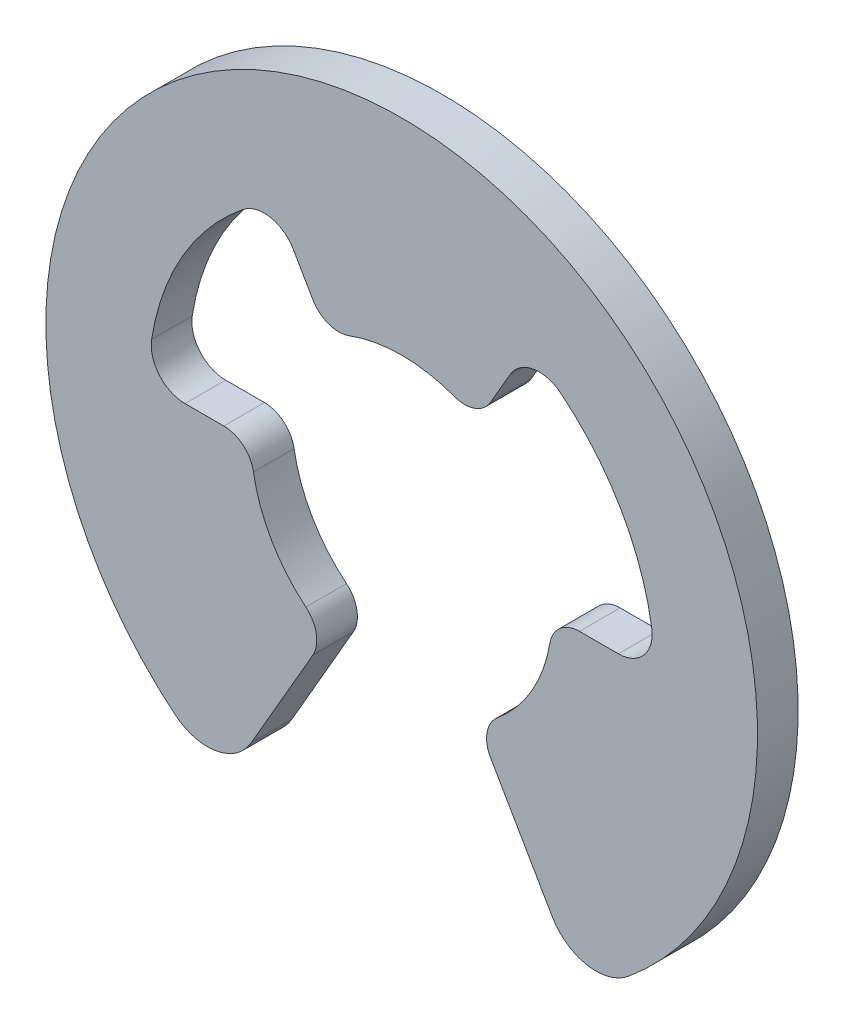
ISO-10303-21;
HEADER;
FILE_DESCRIPTION(('STEP AP214'),'2;1');
FILE_NAME('part.step','',(''),(''),'','','');
FILE_SCHEMA(('AUTOMOTIVE_DESIGN { 1 0 10303 214 1 1 1 1 }'));
ENDSEC;
DATA;
#1=APPLICATION_CONTEXT('core data for automotive mechanical design processes');
#2=APPLICATION_PROTOCOL_DEFINITION('international standard','automotive_design',2000,#1);
#3=PRODUCT_CONTEXT('',#1,'mechanical');
#4=PRODUCT('Part','Part','',(#3));
#5=PRODUCT_RELATED_PRODUCT_CATEGORY('part','',(#4));
#6=PRODUCT_DEFINITION_FORMATION('','',#4);
#7=PRODUCT_DEFINITION_CONTEXT('part definition',#1,'design');
#8=PRODUCT_DEFINITION('design','',#6,#7);
#9=PRODUCT_DEFINITION_SHAPE('','',#8);
#10=(LENGTH_UNIT() NAMED_UNIT(*) SI_UNIT(.MILLI.,.METRE.));
#11=(NAMED_UNIT(*) PLANE_ANGLE_UNIT() SI_UNIT($,.RADIAN.));
#12=(NAMED_UNIT(*) SI_UNIT($,.STERADIAN.) SOLID_ANGLE_UNIT());
#13=UNCERTAINTY_MEASURE_WITH_UNIT(LENGTH_MEASURE(1.E-05),#10,'distance_accuracy_value','');
#14=(GEOMETRIC_REPRESENTATION_CONTEXT(3) GLOBAL_UNCERTAINTY_ASSIGNED_CONTEXT((#13)) GLOBAL_UNIT_ASSIGNED_CONTEXT((#10,
#11,#12)) REPRESENTATION_CONTEXT('',''));
#15=CARTESIAN_POINT('',(0.,0.,0.));
#16=DIRECTION('',(0.,0.,1.));
#17=DIRECTION('',(1.,0.,0.));
#18=AXIS2_PLACEMENT_3D('',#15,#16,#17);
#19=CARTESIAN_POINT('',(1.3899829450393,-2.4075210824622,0.3175));
#20=DIRECTION('',(0.866025403784445,0.49999999999999,0.));
#21=DIRECTION('',(-0.49999999999999,0.866025403784445,0.));
#22=AXIS2_PLACEMENT_3D('',#19,#20,#21);
#23=PLANE('',#22);
#24=DIRECTION('',(0.49999999999999,-0.866025403784445,0.));
#25=VECTOR('',#24,1.);
#26=CARTESIAN_POINT('',(1.3899829450393,-2.4075210824622,-0.3175));
#27=LINE('',#26,#25);
#28=CARTESIAN_POINT('',(1.3899829450393,-2.4075210824622,-0.3175));
#29=VERTEX_POINT('',#28);
#30=CARTESIAN_POINT('',(2.3526660020071,-4.07493704871621,-0.3175));
#31=VERTEX_POINT('',#30);
#32=EDGE_CURVE('E11',#29,#31,#27,.T.);
#33=ORIENTED_EDGE('',*,*,#32,.T.);
#34=DIRECTION('',(0.,0.,-1.));
#35=VECTOR('',#34,1.);
#36=CARTESIAN_POINT('',(2.3526660020071,-4.07493704871621,0.3175));
#37=LINE('',#36,#35);
#38=CARTESIAN_POINT('',(2.3526660020071,-4.07493704871621,0.3175));
#39=VERTEX_POINT('',#38);
#40=EDGE_CURVE('E25',#39,#31,#37,.T.);
#41=ORIENTED_EDGE('',*,*,#40,.F.);
#42=DIRECTION('',(0.49999999999999,-0.866025403784445,0.));
#43=VECTOR('',#42,1.);
#44=CARTESIAN_POINT('',(1.3899829450393,-2.4075210824622,0.3175));
#45=LINE('',#44,#43);
#46=CARTESIAN_POINT('',(1.3899829450393,-2.4075210824622,0.3175));
#47=VERTEX_POINT('',#46);
#48=EDGE_CURVE('E352',#47,#39,#45,.T.);
#49=ORIENTED_EDGE('',*,*,#48,.F.);
#50=DIRECTION('',(0.,0.,-1.));
#51=VECTOR('',#50,1.);
#52=CARTESIAN_POINT('',(1.3899829450393,-2.4075210824622,0.3175));
#53=LINE('',#52,#51);
#54=EDGE_CURVE('E348',#47,#29,#53,.T.);
#55=ORIENTED_EDGE('',*,*,#54,.T.);
#56=EDGE_LOOP('',(#33,#41,#49,#55));
#57=FACE_BOUND('',#56,.T.);
#58=ADVANCED_FACE('F17',(#57),#23,.F.);
#59=CARTESIAN_POINT('',(1.79692828227748,-2.17257108246213,0.3175));
#60=DIRECTION('',(0.,0.,1.));
#61=DIRECTION('',(0.984186439950114,-0.177135686461876,0.));
#62=AXIS2_PLACEMENT_3D('',#59,#60,#61);
#63=CYLINDRICAL_SURFACE('',#62,0.4699);
#64=CARTESIAN_POINT('',(1.79692828227748,-2.17257108246213,-0.3175));
#65=DIRECTION('',(0.,0.,1.));
#66=DIRECTION('',(1.,0.,0.));
#67=AXIS2_PLACEMENT_3D('',#64,#65,#66);
#68=CIRCLE('',#67,0.4699);
#69=CARTESIAN_POINT('',(1.4974402352313,-1.8104759020518,-0.3175));
#70=VERTEX_POINT('',#69);
#71=EDGE_CURVE('E343',#70,#29,#68,.T.);
#72=ORIENTED_EDGE('',*,*,#71,.T.);
#73=ORIENTED_EDGE('',*,*,#54,.F.);
#74=CARTESIAN_POINT('',(1.79692828227748,-2.17257108246213,0.3175));
#75=DIRECTION('',(0.,0.,1.));
#76=DIRECTION('',(1.,0.,0.));
#77=AXIS2_PLACEMENT_3D('',#74,#75,#76);
#78=CIRCLE('',#77,0.4699);
#79=CARTESIAN_POINT('',(1.4974402352313,-1.8104759020518,0.3175));
#80=VERTEX_POINT('',#79);
#81=EDGE_CURVE('E338',#80,#47,#78,.T.);
#82=ORIENTED_EDGE('',*,*,#81,.F.);
#83=DIRECTION('',(0.,0.,-1.));
#84=VECTOR('',#83,1.);
#85=CARTESIAN_POINT('',(1.4974402352313,-1.8104759020518,0.3175));
#86=LINE('',#85,#84);
#87=EDGE_CURVE('E334',#80,#70,#86,.T.);
#88=ORIENTED_EDGE('',*,*,#87,.T.);
#89=EDGE_LOOP('',(#72,#73,#82,#88));
#90=FACE_BOUND('',#89,.T.);
#91=ADVANCED_FACE('F365',(#90),#63,.T.);
#92=CARTESIAN_POINT('',(-2.76688394418299E-13,2.28224557308199E-13,0.3175));
#93=DIRECTION('',(0.,0.,1.));
#94=DIRECTION('',(-0.866025405042973,0.499999997820154,0.));
#95=AXIS2_PLACEMENT_3D('',#92,#93,#94);
#96=CYLINDRICAL_SURFACE('',#95,2.3495);
#97=DIRECTION('',(0.,0.,-1.));
#98=VECTOR('',#97,1.);
#99=CARTESIAN_POINT('',(2.3166382437034,-0.39158332167097,0.3175));
#100=LINE('',#99,#98);
#101=CARTESIAN_POINT('',(2.3166382437034,-0.39158332167097,0.3175));
#102=VERTEX_POINT('',#101);
#103=CARTESIAN_POINT('',(2.3166382437034,-0.39158332167097,-0.3175));
#104=VERTEX_POINT('',#103);
#105=EDGE_CURVE('E330',#102,#104,#100,.T.);
#106=ORIENTED_EDGE('',*,*,#105,.T.);
#107=CARTESIAN_POINT('',(-2.76688394418299E-13,2.28224557308199E-13,-0.3175));
#108=DIRECTION('',(0.,0.,1.));
#109=DIRECTION('',(1.,0.,0.));
#110=AXIS2_PLACEMENT_3D('',#107,#108,#109);
#111=CIRCLE('',#110,2.3495);
#112=EDGE_CURVE('E325',#70,#104,#111,.T.);
#113=ORIENTED_EDGE('',*,*,#112,.F.);
#114=ORIENTED_EDGE('',*,*,#87,.F.);
#115=CARTESIAN_POINT('',(-2.76688394418299E-13,2.28224557308199E-13,0.3175));
#116=DIRECTION('',(0.,0.,1.));
#117=DIRECTION('',(1.,0.,0.));
#118=AXIS2_PLACEMENT_3D('',#115,#116,#117);
#119=CIRCLE('',#118,2.3495);
#120=EDGE_CURVE('E321',#80,#102,#119,.T.);
#121=ORIENTED_EDGE('',*,*,#120,.T.);
#122=EDGE_LOOP('',(#106,#113,#114,#121));
#123=FACE_BOUND('',#122,.T.);
#124=ADVANCED_FACE('F372',(#123),#96,.F.);
#125=CARTESIAN_POINT('',(3.03787396173535,-3.67933204871633,0.3175));
#126=DIRECTION('',(0.,0.,1.));
#127=DIRECTION('',(1.,0.,0.));
#128=AXIS2_PLACEMENT_3D('',#125,#126,#127);
#129=PLANE('',#128);
#130=CARTESIAN_POINT('',(3.03787396173535,-3.67933204871633,0.3175));
#131=DIRECTION('',(0.,0.,1.));
#132=DIRECTION('',(1.,0.,0.));
#133=AXIS2_PLACEMENT_3D('',#130,#131,#132);
#134=CIRCLE('',#133,0.79121);
#135=CARTESIAN_POINT('',(3.5416257799309,-4.28945283164751,0.3175));
#136=VERTEX_POINT('',#135);
#137=EDGE_CURVE('E317',#39,#136,#134,.T.);
#138=ORIENTED_EDGE('',*,*,#137,.T.);
#139=CARTESIAN_POINT('',(0.,0.,0.3175));
#140=DIRECTION('',(0.,0.,1.));
#141=DIRECTION('',(1.,0.,0.));
#142=AXIS2_PLACEMENT_3D('',#139,#140,#141);
#143=CIRCLE('',#142,5.5626);
#144=CARTESIAN_POINT('',(-3.5416257525688,-4.28945285423929,0.3175));
#145=VERTEX_POINT('',#144);
#146=EDGE_CURVE('E189',#136,#145,#143,.T.);
#147=ORIENTED_EDGE('',*,*,#146,.T.);
#148=CARTESIAN_POINT('',(-3.03787396173538,-3.67933204871631,0.3175));
#149=DIRECTION('',(0.,0.,1.));
#150=DIRECTION('',(1.,0.,0.));
#151=AXIS2_PLACEMENT_3D('',#148,#149,#150);
#152=CIRCLE('',#151,0.79121);
#153=CARTESIAN_POINT('',(-2.3526660020071,-4.07493704871621,0.3175));
#154=VERTEX_POINT('',#153);
#155=EDGE_CURVE('E310',#145,#154,#152,.T.);
#156=ORIENTED_EDGE('',*,*,#155,.T.);
#157=DIRECTION('',(0.49999999999999,0.866025403784445,0.));
#158=VECTOR('',#157,1.);
#159=CARTESIAN_POINT('',(-2.3526660020071,-4.07493704871621,0.3175));
#160=LINE('',#159,#158);
#161=CARTESIAN_POINT('',(-1.3899829450393,-2.4075210824622,0.3175));
#162=VERTEX_POINT('',#161);
#163=EDGE_CURVE('E306',#154,#162,#160,.T.);
#164=ORIENTED_EDGE('',*,*,#163,.T.);
#165=CARTESIAN_POINT('',(-1.79692828227748,-2.17257108246213,0.3175));
#166=DIRECTION('',(0.,0.,1.));
#167=DIRECTION('',(1.,0.,0.));
#168=AXIS2_PLACEMENT_3D('',#165,#166,#167);
#169=CIRCLE('',#168,0.4699);
#170=CARTESIAN_POINT('',(-1.4974402352313,-1.8104759020518,0.3175));
#171=VERTEX_POINT('',#170);
#172=EDGE_CURVE('E302',#162,#171,#169,.T.);
#173=ORIENTED_EDGE('',*,*,#172,.T.);
#174=CARTESIAN_POINT('',(2.6628005356244E-13,2.19442519711066E-13,0.3175));
#175=DIRECTION('',(0.,0.,1.));
#176=DIRECTION('',(1.,0.,0.));
#177=AXIS2_PLACEMENT_3D('',#174,#175,#176);
#178=CIRCLE('',#177,2.3495);
#179=CARTESIAN_POINT('',(-2.3166382417321,-0.391583333333329,0.3175));
#180=VERTEX_POINT('',#179);
#181=EDGE_CURVE('E297',#180,#171,#178,.T.);
#182=ORIENTED_EDGE('',*,*,#181,.F.);
#183=CARTESIAN_POINT('',(-2.77996589007846,-0.469899999999929,0.3175));
#184=DIRECTION('',(0.,0.,1.));
#185=DIRECTION('',(1.,0.,0.));
#186=AXIS2_PLACEMENT_3D('',#183,#184,#185);
#187=CIRCLE('',#186,0.4699);
#188=CARTESIAN_POINT('',(-2.77996589007851,0.,0.3175));
#189=VERTEX_POINT('',#188);
#190=EDGE_CURVE('E293',#180,#189,#187,.T.);
#191=ORIENTED_EDGE('',*,*,#190,.T.);
#192=DIRECTION('',(-1.,0.,0.));
#193=VECTOR('',#192,1.);
#194=CARTESIAN_POINT('',(-2.77996589007851,0.,0.3175));
#195=LINE('',#194,#193);
#196=CARTESIAN_POINT('',(-3.38775882285519,0.,0.3175));
#197=VERTEX_POINT('',#196);
#198=EDGE_CURVE('E289',#189,#197,#195,.T.);
#199=ORIENTED_EDGE('',*,*,#198,.T.);
#200=CARTESIAN_POINT('',(-3.38775882285514,0.527473333333405,0.3175));
#201=DIRECTION('',(0.,0.,1.));
#202=DIRECTION('',(1.,0.,0.));
#203=AXIS2_PLACEMENT_3D('',#200,#201,#202);
#204=CIRCLE('',#203,0.52747333418);
#205=CARTESIAN_POINT('',(-3.9089524848923,0.60862309630375,0.3175));
#206=VERTEX_POINT('',#205);
#207=EDGE_CURVE('E284',#206,#197,#204,.T.);
#208=ORIENTED_EDGE('',*,*,#207,.F.);
#209=CARTESIAN_POINT('',(5.96311194867028E-13,-3.00540842212981E-13,0.3175));
#210=DIRECTION('',(0.,0.,1.));
#211=DIRECTION('',(1.,0.,0.));
#212=AXIS2_PLACEMENT_3D('',#209,#210,#211);
#213=CIRCLE('',#212,3.95605);
#214=CARTESIAN_POINT('',(-2.4815592898998,3.0809406182548,0.3175));
#215=VERTEX_POINT('',#214);
#216=EDGE_CURVE('E279',#215,#206,#213,.T.);
#217=ORIENTED_EDGE('',*,*,#216,.F.);
#218=CARTESIAN_POINT('',(-2.15068471791316,2.67014853582075,0.3175));
#219=DIRECTION('',(0.,0.,1.));
#220=DIRECTION('',(1.,0.,0.));
#221=AXIS2_PLACEMENT_3D('',#218,#219,#220);
#222=CIRCLE('',#221,0.52747333418);
#223=CARTESIAN_POINT('',(-1.6938794114276,2.93388520248751,0.3175));
#224=VERTEX_POINT('',#223);
#225=EDGE_CURVE('E274',#224,#215,#222,.T.);
#226=ORIENTED_EDGE('',*,*,#225,.F.);
#227=DIRECTION('',(0.499999999999917,-0.866025403784486,0.));
#228=VECTOR('',#227,1.);
#229=CARTESIAN_POINT('',(-1.6938794114276,2.93388520248751,0.3175));
#230=LINE('',#229,#228);
#231=CARTESIAN_POINT('',(-1.3899829450393,2.4075210824622,0.3175));
#232=VERTEX_POINT('',#231);
#233=EDGE_CURVE('E270',#224,#232,#230,.T.);
#234=ORIENTED_EDGE('',*,*,#233,.T.);
#235=CARTESIAN_POINT('',(-0.983037607800999,2.64247108246225,0.3175));
#236=DIRECTION('',(0.,0.,1.));
#237=DIRECTION('',(1.,0.,0.));
#238=AXIS2_PLACEMENT_3D('',#235,#236,#237);
#239=CIRCLE('',#238,0.4699);
#240=CARTESIAN_POINT('',(-0.819197995415231,2.2020592395092,0.3175));
#241=VERTEX_POINT('',#240);
#242=EDGE_CURVE('E266',#232,#241,#239,.T.);
#243=ORIENTED_EDGE('',*,*,#242,.T.);
#244=CARTESIAN_POINT('',(0.,-4.87890977618478E-13,0.3175));
#245=DIRECTION('',(0.,0.,1.));
#246=DIRECTION('',(1.,0.,0.));
#247=AXIS2_PLACEMENT_3D('',#244,#245,#246);
#248=CIRCLE('',#247,2.3495);
#249=CARTESIAN_POINT('',(0.819198006500791,2.2020592353852,0.3175));
#250=VERTEX_POINT('',#249);
#251=EDGE_CURVE('E261',#250,#241,#248,.T.);
#252=ORIENTED_EDGE('',*,*,#251,.F.);
#253=CARTESIAN_POINT('',(0.983037607800984,2.64247108246225,0.3175));
#254=DIRECTION('',(0.,0.,1.));
#255=DIRECTION('',(1.,0.,0.));
#256=AXIS2_PLACEMENT_3D('',#253,#254,#255);
#257=CIRCLE('',#256,0.4699);
#258=CARTESIAN_POINT('',(1.3899829450393,2.4075210824622,0.3175));
#259=VERTEX_POINT('',#258);
#260=EDGE_CURVE('E257',#250,#259,#257,.T.);
#261=ORIENTED_EDGE('',*,*,#260,.T.);
#262=DIRECTION('',(0.499999999999917,0.866025403784486,0.));
#263=VECTOR('',#262,1.);
#264=CARTESIAN_POINT('',(1.3899829450393,2.4075210824622,0.3175));
#265=LINE('',#264,#263);
#266=CARTESIAN_POINT('',(1.6938794114276,2.93388520248751,0.3175));
#267=VERTEX_POINT('',#266);
#268=EDGE_CURVE('E253',#259,#267,#265,.T.);
#269=ORIENTED_EDGE('',*,*,#268,.T.);
#270=CARTESIAN_POINT('',(2.15068471791316,2.67014853582075,0.3175));
#271=DIRECTION('',(0.,0.,1.));
#272=DIRECTION('',(1.,0.,0.));
#273=AXIS2_PLACEMENT_3D('',#270,#271,#272);
#274=CIRCLE('',#273,0.52747333418);
#275=CARTESIAN_POINT('',(2.4815592898998,3.0809406182548,0.3175));
#276=VERTEX_POINT('',#275);
#277=EDGE_CURVE('E248',#276,#267,#274,.T.);
#278=ORIENTED_EDGE('',*,*,#277,.F.);
#279=CARTESIAN_POINT('',(-6.83481049534862E-13,-3.73832909073001E-13,0.3175));
#280=DIRECTION('',(0.,0.,1.));
#281=DIRECTION('',(1.,0.,0.));
#282=AXIS2_PLACEMENT_3D('',#279,#280,#281);
#283=CIRCLE('',#282,3.95605);
#284=CARTESIAN_POINT('',(3.90895247530291,0.60862315789288,0.3175));
#285=VERTEX_POINT('',#284);
#286=EDGE_CURVE('E243',#285,#276,#283,.T.);
#287=ORIENTED_EDGE('',*,*,#286,.F.);
#288=CARTESIAN_POINT('',(3.38775882285529,0.527473333333291,0.3175));
#289=DIRECTION('',(0.,0.,1.));
#290=DIRECTION('',(1.,0.,0.));
#291=AXIS2_PLACEMENT_3D('',#288,#289,#290);
#292=CIRCLE('',#291,0.52747333418);
#293=CARTESIAN_POINT('',(3.38775882285519,0.,0.3175));
#294=VERTEX_POINT('',#293);
#295=EDGE_CURVE('E238',#294,#285,#292,.T.);
#296=ORIENTED_EDGE('',*,*,#295,.F.);
#297=DIRECTION('',(-1.,0.,0.));
#298=VECTOR('',#297,1.);
#299=CARTESIAN_POINT('',(3.38775882285519,0.,0.3175));
#300=LINE('',#299,#298);
#301=CARTESIAN_POINT('',(2.77996589007851,0.,0.3175));
#302=VERTEX_POINT('',#301);
#303=EDGE_CURVE('E234',#294,#302,#300,.T.);
#304=ORIENTED_EDGE('',*,*,#303,.T.);
#305=CARTESIAN_POINT('',(2.77996589007846,-0.469899999999924,0.3175));
#306=DIRECTION('',(0.,0.,1.));
#307=DIRECTION('',(1.,0.,0.));
#308=AXIS2_PLACEMENT_3D('',#305,#306,#307);
#309=CIRCLE('',#308,0.4699);
#310=EDGE_CURVE('E229',#302,#102,#309,.T.);
#311=ORIENTED_EDGE('',*,*,#310,.T.);
#312=ORIENTED_EDGE('',*,*,#120,.F.);
#313=ORIENTED_EDGE('',*,*,#81,.T.);
#314=ORIENTED_EDGE('',*,*,#48,.T.);
#315=EDGE_LOOP('',(#138,#147,#156,#164,#173,#182,#191,#199,#208,#217,#226,#234,#243,#252,#261,
#269,#278,#287,#296,#304,#311,#312,#313,#314));
#316=FACE_BOUND('',#315,.T.);
#317=ADVANCED_FACE('F361',(#316),#129,.T.);
#318=CARTESIAN_POINT('',(2.77996589007846,-0.469899999999924,0.3175));
#319=DIRECTION('',(0.,0.,1.));
#320=DIRECTION('',(0.645497214755627,-0.763762623949829,0.));
#321=AXIS2_PLACEMENT_3D('',#318,#319,#320);
#322=CYLINDRICAL_SURFACE('',#321,0.4699);
#323=CARTESIAN_POINT('',(2.77996589007846,-0.469899999999924,-0.3175));
#324=DIRECTION('',(0.,0.,1.));
#325=DIRECTION('',(1.,0.,0.));
#326=AXIS2_PLACEMENT_3D('',#323,#324,#325);
#327=CIRCLE('',#326,0.4699);
#328=CARTESIAN_POINT('',(2.77996589007851,0.,-0.3175));
#329=VERTEX_POINT('',#328);
#330=EDGE_CURVE('E224',#329,#104,#327,.T.);
#331=ORIENTED_EDGE('',*,*,#330,.T.);
#332=ORIENTED_EDGE('',*,*,#105,.F.);
#333=ORIENTED_EDGE('',*,*,#310,.F.);
#334=DIRECTION('',(0.,0.,-1.));
#335=VECTOR('',#334,1.);
#336=CARTESIAN_POINT('',(2.77996589007851,0.,0.3175));
#337=LINE('',#336,#335);
#338=EDGE_CURVE('E220',#302,#329,#337,.T.);
#339=ORIENTED_EDGE('',*,*,#338,.T.);
#340=EDGE_LOOP('',(#331,#332,#333,#339));
#341=FACE_BOUND('',#340,.T.);
#342=ADVANCED_FACE('F376',(#341),#322,.T.);
#343=CARTESIAN_POINT('',(3.38775882285519,0.,0.3175));
#344=DIRECTION('',(0.,-1.,0.));
#345=DIRECTION('',(0.,0.,-1.));
#346=AXIS2_PLACEMENT_3D('',#343,#344,#345);
#347=PLANE('',#346);
#348=DIRECTION('',(-1.,0.,0.));
#349=VECTOR('',#348,1.);
#350=CARTESIAN_POINT('',(3.38775882285519,0.,-0.3175));
#351=LINE('',#350,#349);
#352=CARTESIAN_POINT('',(3.38775882285519,0.,-0.3175));
#353=VERTEX_POINT('',#352);
#354=EDGE_CURVE('E215',#353,#329,#351,.T.);
#355=ORIENTED_EDGE('',*,*,#354,.T.);
#356=ORIENTED_EDGE('',*,*,#338,.F.);
#357=ORIENTED_EDGE('',*,*,#303,.F.);
#358=DIRECTION('',(0.,0.,-1.));
#359=VECTOR('',#358,1.);
#360=CARTESIAN_POINT('',(3.38775882285519,0.,0.3175));
#361=LINE('',#360,#359);
#362=EDGE_CURVE('E211',#294,#353,#361,.T.);
#363=ORIENTED_EDGE('',*,*,#362,.T.);
#364=EDGE_LOOP('',(#355,#356,#357,#363));
#365=FACE_BOUND('',#364,.T.);
#366=ADVANCED_FACE('F380',(#365),#347,.F.);
#367=CARTESIAN_POINT('',(3.38775882285529,0.527473333333291,0.3175));
#368=DIRECTION('',(0.,0.,1.));
#369=DIRECTION('',(-0.759554575837402,0.650443576587903,0.));
#370=AXIS2_PLACEMENT_3D('',#367,#368,#369);
#371=CYLINDRICAL_SURFACE('',#370,0.52747333418);
#372=DIRECTION('',(0.,0.,-1.));
#373=VECTOR('',#372,1.);
#374=CARTESIAN_POINT('',(3.90895247530291,0.60862315789288,0.3175));
#375=LINE('',#374,#373);
#376=CARTESIAN_POINT('',(3.90895247530291,0.60862315789288,-0.3175));
#377=VERTEX_POINT('',#376);
#378=EDGE_CURVE('E199',#285,#377,#375,.T.);
#379=ORIENTED_EDGE('',*,*,#378,.T.);
#380=CARTESIAN_POINT('',(3.38775882285529,0.527473333333291,-0.3175));
#381=DIRECTION('',(0.,0.,1.));
#382=DIRECTION('',(1.,0.,0.));
#383=AXIS2_PLACEMENT_3D('',#380,#381,#382);
#384=CIRCLE('',#383,0.52747333418);
#385=EDGE_CURVE('E195',#353,#377,#384,.T.);
#386=ORIENTED_EDGE('',*,*,#385,.F.);
#387=ORIENTED_EDGE('',*,*,#362,.F.);
#388=ORIENTED_EDGE('',*,*,#295,.T.);
#389=EDGE_LOOP('',(#379,#386,#387,#388));
#390=FACE_BOUND('',#389,.T.);
#391=ADVANCED_FACE('F619',(#390),#371,.F.);
#392=CARTESIAN_POINT('',(3.03787396173535,-3.67933204871633,-0.3175));
#393=DIRECTION('',(0.,0.,1.));
#394=DIRECTION('',(1.,0.,0.));
#395=AXIS2_PLACEMENT_3D('',#392,#393,#394);
#396=PLANE('',#395);
#397=CARTESIAN_POINT('',(3.03787396173535,-3.67933204871633,-0.3175));
#398=DIRECTION('',(0.,0.,1.));
#399=DIRECTION('',(1.,0.,0.));
#400=AXIS2_PLACEMENT_3D('',#397,#398,#399);
#401=CIRCLE('',#400,0.79121);
#402=CARTESIAN_POINT('',(3.5416257799309,-4.28945283164751,-0.3175));
#403=VERTEX_POINT('',#402);
#404=EDGE_CURVE('E177',#31,#403,#401,.T.);
#405=ORIENTED_EDGE('',*,*,#404,.F.);
#406=ORIENTED_EDGE('',*,*,#32,.F.);
#407=ORIENTED_EDGE('',*,*,#71,.F.);
#408=ORIENTED_EDGE('',*,*,#112,.T.);
#409=ORIENTED_EDGE('',*,*,#330,.F.);
#410=ORIENTED_EDGE('',*,*,#354,.F.);
#411=ORIENTED_EDGE('',*,*,#385,.T.);
#412=CARTESIAN_POINT('',(-6.83481049534862E-13,-3.73832909073001E-13,-0.3175));
#413=DIRECTION('',(0.,0.,1.));
#414=DIRECTION('',(1.,0.,0.));
#415=AXIS2_PLACEMENT_3D('',#412,#413,#414);
#416=CIRCLE('',#415,3.95605);
#417=CARTESIAN_POINT('',(2.4815592898998,3.0809406182548,-0.3175));
#418=VERTEX_POINT('',#417);
#419=EDGE_CURVE('E196',#377,#418,#416,.T.);
#420=ORIENTED_EDGE('',*,*,#419,.T.);
#421=CARTESIAN_POINT('',(2.15068471791316,2.67014853582075,-0.3175));
#422=DIRECTION('',(0.,0.,1.));
#423=DIRECTION('',(1.,0.,0.));
#424=AXIS2_PLACEMENT_3D('',#421,#422,#423);
#425=CIRCLE('',#424,0.52747333418);
#426=CARTESIAN_POINT('',(1.6938794114276,2.93388520248751,-0.3175));
#427=VERTEX_POINT('',#426);
#428=EDGE_CURVE('E201',#418,#427,#425,.T.);
#429=ORIENTED_EDGE('',*,*,#428,.T.);
#430=DIRECTION('',(0.499999999999917,0.866025403784486,0.));
#431=VECTOR('',#430,1.);
#432=CARTESIAN_POINT('',(1.3899829450393,2.4075210824622,-0.3175));
#433=LINE('',#432,#431);
#434=CARTESIAN_POINT('',(1.3899829450393,2.4075210824622,-0.3175));
#435=VERTEX_POINT('',#434);
#436=EDGE_CURVE('E529',#435,#427,#433,.T.);
#437=ORIENTED_EDGE('',*,*,#436,.F.);
#438=CARTESIAN_POINT('',(0.983037607800984,2.64247108246225,-0.3175));
#439=DIRECTION('',(0.,0.,1.));
#440=DIRECTION('',(1.,0.,0.));
#441=AXIS2_PLACEMENT_3D('',#438,#439,#440);
#442=CIRCLE('',#441,0.4699);
#443=CARTESIAN_POINT('',(0.819198006500791,2.2020592353852,-0.3175));
#444=VERTEX_POINT('',#443);
#445=EDGE_CURVE('E524',#444,#435,#442,.T.);
#446=ORIENTED_EDGE('',*,*,#445,.F.);
#447=CARTESIAN_POINT('',(0.,-4.87890977618478E-13,-0.3175));
#448=DIRECTION('',(0.,0.,1.));
#449=DIRECTION('',(1.,0.,0.));
#450=AXIS2_PLACEMENT_3D('',#447,#448,#449);
#451=CIRCLE('',#450,2.3495);
#452=CARTESIAN_POINT('',(-0.819197995415231,2.2020592395092,-0.3175));
#453=VERTEX_POINT('',#452);
#454=EDGE_CURVE('E520',#444,#453,#451,.T.);
#455=ORIENTED_EDGE('',*,*,#454,.T.);
#456=CARTESIAN_POINT('',(-0.983037607800999,2.64247108246225,-0.3175));
#457=DIRECTION('',(0.,0.,1.));
#458=DIRECTION('',(1.,0.,0.));
#459=AXIS2_PLACEMENT_3D('',#456,#457,#458);
#460=CIRCLE('',#459,0.4699);
#461=CARTESIAN_POINT('',(-1.3899829450393,2.4075210824622,-0.3175));
#462=VERTEX_POINT('',#461);
#463=EDGE_CURVE('E515',#462,#453,#460,.T.);
#464=ORIENTED_EDGE('',*,*,#463,.F.);
#465=DIRECTION('',(0.499999999999917,-0.866025403784486,0.));
#466=VECTOR('',#465,1.);
#467=CARTESIAN_POINT('',(-1.6938794114276,2.93388520248751,-0.3175));
#468=LINE('',#467,#466);
#469=CARTESIAN_POINT('',(-1.6938794114276,2.93388520248751,-0.3175));
#470=VERTEX_POINT('',#469);
#471=EDGE_CURVE('E510',#470,#462,#468,.T.);
#472=ORIENTED_EDGE('',*,*,#471,.F.);
#473=CARTESIAN_POINT('',(-2.15068471791316,2.67014853582075,-0.3175));
#474=DIRECTION('',(0.,0.,1.));
#475=DIRECTION('',(1.,0.,0.));
#476=AXIS2_PLACEMENT_3D('',#473,#474,#475);
#477=CIRCLE('',#476,0.52747333418);
#478=CARTESIAN_POINT('',(-2.4815592898998,3.0809406182548,-0.3175));
#479=VERTEX_POINT('',#478);
#480=EDGE_CURVE('E506',#470,#479,#477,.T.);
#481=ORIENTED_EDGE('',*,*,#480,.T.);
#482=CARTESIAN_POINT('',(5.96311194867028E-13,-3.00540842212981E-13,-0.3175));
#483=DIRECTION('',(0.,0.,1.));
#484=DIRECTION('',(1.,0.,0.));
#485=AXIS2_PLACEMENT_3D('',#482,#483,#484);
#486=CIRCLE('',#485,3.95605);
#487=CARTESIAN_POINT('',(-3.9089524848923,0.60862309630375,-0.3175));
#488=VERTEX_POINT('',#487);
#489=EDGE_CURVE('E502',#479,#488,#486,.T.);
#490=ORIENTED_EDGE('',*,*,#489,.T.);
#491=CARTESIAN_POINT('',(-3.38775882285514,0.527473333333405,-0.3175));
#492=DIRECTION('',(0.,0.,1.));
#493=DIRECTION('',(1.,0.,0.));
#494=AXIS2_PLACEMENT_3D('',#491,#492,#493);
#495=CIRCLE('',#494,0.52747333418);
#496=CARTESIAN_POINT('',(-3.38775882285519,0.,-0.3175));
#497=VERTEX_POINT('',#496);
#498=EDGE_CURVE('E498',#488,#497,#495,.T.);
#499=ORIENTED_EDGE('',*,*,#498,.T.);
#500=DIRECTION('',(-1.,0.,0.));
#501=VECTOR('',#500,1.);
#502=CARTESIAN_POINT('',(-2.77996589007851,0.,-0.3175));
#503=LINE('',#502,#501);
#504=CARTESIAN_POINT('',(-2.77996589007851,0.,-0.3175));
#505=VERTEX_POINT('',#504);
#506=EDGE_CURVE('E493',#505,#497,#503,.T.);
#507=ORIENTED_EDGE('',*,*,#506,.F.);
#508=CARTESIAN_POINT('',(-2.77996589007846,-0.469899999999929,-0.3175));
#509=DIRECTION('',(0.,0.,1.));
#510=DIRECTION('',(1.,0.,0.));
#511=AXIS2_PLACEMENT_3D('',#508,#509,#510);
#512=CIRCLE('',#511,0.4699);
#513=CARTESIAN_POINT('',(-2.3166382417321,-0.391583333333329,-0.3175));
#514=VERTEX_POINT('',#513);
#515=EDGE_CURVE('E488',#514,#505,#512,.T.);
#516=ORIENTED_EDGE('',*,*,#515,.F.);
#517=CARTESIAN_POINT('',(2.6628005356244E-13,2.19442519711066E-13,-0.3175));
#518=DIRECTION('',(0.,0.,1.));
#519=DIRECTION('',(1.,0.,0.));
#520=AXIS2_PLACEMENT_3D('',#517,#518,#519);
#521=CIRCLE('',#520,2.3495);
#522=CARTESIAN_POINT('',(-1.4974402352313,-1.8104759020518,-0.3175));
#523=VERTEX_POINT('',#522);
#524=EDGE_CURVE('E484',#514,#523,#521,.T.);
#525=ORIENTED_EDGE('',*,*,#524,.T.);
#526=CARTESIAN_POINT('',(-1.79692828227748,-2.17257108246213,-0.3175));
#527=DIRECTION('',(0.,0.,1.));
#528=DIRECTION('',(1.,0.,0.));
#529=AXIS2_PLACEMENT_3D('',#526,#527,#528);
#530=CIRCLE('',#529,0.4699);
#531=CARTESIAN_POINT('',(-1.3899829450393,-2.4075210824622,-0.3175));
#532=VERTEX_POINT('',#531);
#533=EDGE_CURVE('E479',#532,#523,#530,.T.);
#534=ORIENTED_EDGE('',*,*,#533,.F.);
#535=DIRECTION('',(0.49999999999999,0.866025403784445,0.));
#536=VECTOR('',#535,1.);
#537=CARTESIAN_POINT('',(-2.3526660020071,-4.07493704871621,-0.3175));
#538=LINE('',#537,#536);
#539=CARTESIAN_POINT('',(-2.3526660020071,-4.07493704871621,-0.3175));
#540=VERTEX_POINT('',#539);
#541=EDGE_CURVE('E474',#540,#532,#538,.T.);
#542=ORIENTED_EDGE('',*,*,#541,.F.);
#543=CARTESIAN_POINT('',(-3.03787396173538,-3.67933204871631,-0.3175));
#544=DIRECTION('',(0.,0.,1.));
#545=DIRECTION('',(1.,0.,0.));
#546=AXIS2_PLACEMENT_3D('',#543,#544,#545);
#547=CIRCLE('',#546,0.79121);
#548=CARTESIAN_POINT('',(-3.5416257525688,-4.28945285423929,-0.3175));
#549=VERTEX_POINT('',#548);
#550=EDGE_CURVE('E179',#549,#540,#547,.T.);
#551=ORIENTED_EDGE('',*,*,#550,.F.);
#552=CARTESIAN_POINT('',(0.,0.,-0.3175));
#553=DIRECTION('',(0.,0.,1.));
#554=DIRECTION('',(1.,0.,0.));
#555=AXIS2_PLACEMENT_3D('',#552,#553,#554);
#556=CIRCLE('',#555,5.5626);
#557=EDGE_CURVE('E173',#403,#549,#556,.T.);
#558=ORIENTED_EDGE('',*,*,#557,.F.);
#559=EDGE_LOOP('',(#405,#406,#407,#408,#409,#410,#411,#420,#429,#437,#446,#455,#464,#472,#481,
#490,#499,#507,#516,#525,#534,#542,#551,#558));
#560=FACE_BOUND('',#559,.T.);
#561=ADVANCED_FACE('F175',(#560),#396,.F.);
#562=CARTESIAN_POINT('',(0.,0.,0.3175));
#563=DIRECTION('',(0.,0.,1.));
#564=DIRECTION('',(3.1894661854346E-09,-1.,0.));
#565=AXIS2_PLACEMENT_3D('',#562,#563,#564);
#566=CYLINDRICAL_SURFACE('',#565,5.5626);
#567=ORIENTED_EDGE('',*,*,#557,.T.);
#568=DIRECTION('',(0.,0.,-1.));
#569=VECTOR('',#568,1.);
#570=CARTESIAN_POINT('',(-3.5416257525688,-4.28945285423929,0.3175));
#571=LINE('',#570,#569);
#572=EDGE_CURVE('E183',#145,#549,#571,.T.);
#573=ORIENTED_EDGE('',*,*,#572,.F.);
#574=ORIENTED_EDGE('',*,*,#146,.F.);
#575=DIRECTION('',(0.,0.,-1.));
#576=VECTOR('',#575,1.);
#577=CARTESIAN_POINT('',(3.5416257799309,-4.28945283164751,0.3175));
#578=LINE('',#577,#576);
#579=EDGE_CURVE('E187',#136,#403,#578,.T.);
#580=ORIENTED_EDGE('',*,*,#579,.T.);
#581=EDGE_LOOP('',(#567,#573,#574,#580));
#582=FACE_BOUND('',#581,.T.);
#583=ADVANCED_FACE('F188',(#582),#566,.T.);
#584=CARTESIAN_POINT('',(3.03787396173535,-3.67933204871633,0.3175));
#585=DIRECTION('',(0.,0.,1.));
#586=DIRECTION('',(0.177556272588247,0.984110649299441,0.));
#587=AXIS2_PLACEMENT_3D('',#584,#585,#586);
#588=CYLINDRICAL_SURFACE('',#587,0.79121);
#589=ORIENTED_EDGE('',*,*,#404,.T.);
#590=ORIENTED_EDGE('',*,*,#579,.F.);
#591=ORIENTED_EDGE('',*,*,#137,.F.);
#592=ORIENTED_EDGE('',*,*,#40,.T.);
#593=EDGE_LOOP('',(#589,#590,#591,#592));
#594=FACE_BOUND('',#593,.T.);
#595=ADVANCED_FACE('F194',(#594),#588,.T.);
#596=CARTESIAN_POINT('',(-3.03787396173538,-3.67933204871631,0.3175));
#597=DIRECTION('',(0.,0.,1.));
#598=DIRECTION('',(-0.177556294655482,0.984110645318003,0.));
#599=AXIS2_PLACEMENT_3D('',#596,#597,#598);
#600=CYLINDRICAL_SURFACE('',#599,0.79121);
#601=ORIENTED_EDGE('',*,*,#550,.T.);
#602=DIRECTION('',(0.,0.,-1.));
#603=VECTOR('',#602,1.);
#604=CARTESIAN_POINT('',(-2.3526660020071,-4.07493704871621,0.3175));
#605=LINE('',#604,#603);
#606=EDGE_CURVE('E192',#154,#540,#605,.T.);
#607=ORIENTED_EDGE('',*,*,#606,.F.);
#608=ORIENTED_EDGE('',*,*,#155,.F.);
#609=ORIENTED_EDGE('',*,*,#572,.T.);
#610=EDGE_LOOP('',(#601,#607,#608,#609));
#611=FACE_BOUND('',#610,.T.);
#612=ADVANCED_FACE('F594',(#611),#600,.T.);
#613=CARTESIAN_POINT('',(-2.3526660020071,-4.07493704871621,0.3175));
#614=DIRECTION('',(-0.866025403784445,0.49999999999999,0.));
#615=DIRECTION('',(-0.49999999999999,-0.866025403784445,0.));
#616=AXIS2_PLACEMENT_3D('',#613,#614,#615);
#617=PLANE('',#616);
#618=ORIENTED_EDGE('',*,*,#541,.T.);
#619=DIRECTION('',(0.,0.,-1.));
#620=VECTOR('',#619,1.);
#621=CARTESIAN_POINT('',(-1.3899829450393,-2.4075210824622,0.3175));
#622=LINE('',#621,#620);
#623=EDGE_CURVE('E455',#162,#532,#622,.T.);
#624=ORIENTED_EDGE('',*,*,#623,.F.);
#625=ORIENTED_EDGE('',*,*,#163,.F.);
#626=ORIENTED_EDGE('',*,*,#606,.T.);
#627=EDGE_LOOP('',(#618,#624,#625,#626));
#628=FACE_BOUND('',#627,.T.);
#629=ADVANCED_FACE('F589',(#628),#617,.F.);
#630=CARTESIAN_POINT('',(-1.79692828227748,-2.17257108246213,0.3175));
#631=DIRECTION('',(0.,0.,1.));
#632=DIRECTION('',(-0.984186439950114,-0.177135686461876,0.));
#633=AXIS2_PLACEMENT_3D('',#630,#631,#632);
#634=CYLINDRICAL_SURFACE('',#633,0.4699);
#635=ORIENTED_EDGE('',*,*,#533,.T.);
#636=DIRECTION('',(0.,0.,-1.));
#637=VECTOR('',#636,1.);
#638=CARTESIAN_POINT('',(-1.4974402352313,-1.8104759020518,0.3175));
#639=LINE('',#638,#637);
#640=EDGE_CURVE('E450',#171,#523,#639,.T.);
#641=ORIENTED_EDGE('',*,*,#640,.F.);
#642=ORIENTED_EDGE('',*,*,#172,.F.);
#643=ORIENTED_EDGE('',*,*,#623,.T.);
#644=EDGE_LOOP('',(#635,#641,#642,#643));
#645=FACE_BOUND('',#644,.T.);
#646=ADVANCED_FACE('F586',(#645),#634,.T.);
#647=CARTESIAN_POINT('',(2.6628005356244E-13,2.19442519711066E-13,0.3175));
#648=DIRECTION('',(0.,0.,1.));
#649=DIRECTION('',(0.86602540378443,0.500000000000015,0.));
#650=AXIS2_PLACEMENT_3D('',#647,#648,#649);
#651=CYLINDRICAL_SURFACE('',#650,2.3495);
#652=ORIENTED_EDGE('',*,*,#640,.T.);
#653=ORIENTED_EDGE('',*,*,#524,.F.);
#654=DIRECTION('',(0.,0.,-1.));
#655=VECTOR('',#654,1.);
#656=CARTESIAN_POINT('',(-2.3166382417321,-0.391583333333329,0.3175));
#657=LINE('',#656,#655);
#658=EDGE_CURVE('E445',#180,#514,#657,.T.);
#659=ORIENTED_EDGE('',*,*,#658,.F.);
#660=ORIENTED_EDGE('',*,*,#181,.T.);
#661=EDGE_LOOP('',(#652,#653,#659,#660));
#662=FACE_BOUND('',#661,.T.);
#663=ADVANCED_FACE('F582',(#662),#651,.F.);
#664=CARTESIAN_POINT('',(-2.77996589007846,-0.469899999999929,0.3175));
#665=DIRECTION('',(0.,0.,1.));
#666=DIRECTION('',(-0.645497224367908,-0.763762615825969,0.));
#667=AXIS2_PLACEMENT_3D('',#664,#665,#666);
#668=CYLINDRICAL_SURFACE('',#667,0.4699);
#669=ORIENTED_EDGE('',*,*,#515,.T.);
#670=DIRECTION('',(0.,0.,-1.));
#671=VECTOR('',#670,1.);
#672=CARTESIAN_POINT('',(-2.77996589007851,0.,0.3175));
#673=LINE('',#672,#671);
#674=EDGE_CURVE('E440',#189,#505,#673,.T.);
#675=ORIENTED_EDGE('',*,*,#674,.F.);
#676=ORIENTED_EDGE('',*,*,#190,.F.);
#677=ORIENTED_EDGE('',*,*,#658,.T.);
#678=EDGE_LOOP('',(#669,#675,#676,#677));
#679=FACE_BOUND('',#678,.T.);
#680=ADVANCED_FACE('F578',(#679),#668,.T.);
#681=CARTESIAN_POINT('',(-2.77996589007851,0.,0.3175));
#682=DIRECTION('',(0.,-1.,0.));
#683=DIRECTION('',(0.,0.,-1.));
#684=AXIS2_PLACEMENT_3D('',#681,#682,#683);
#685=PLANE('',#684);
#686=ORIENTED_EDGE('',*,*,#506,.T.);
#687=DIRECTION('',(0.,0.,-1.));
#688=VECTOR('',#687,1.);
#689=CARTESIAN_POINT('',(-3.38775882285519,0.,0.3175));
#690=LINE('',#689,#688);
#691=EDGE_CURVE('E435',#197,#497,#690,.T.);
#692=ORIENTED_EDGE('',*,*,#691,.F.);
#693=ORIENTED_EDGE('',*,*,#198,.F.);
#694=ORIENTED_EDGE('',*,*,#674,.T.);
#695=EDGE_LOOP('',(#686,#692,#693,#694));
#696=FACE_BOUND('',#695,.T.);
#697=ADVANCED_FACE('F573',(#696),#685,.F.);
#698=CARTESIAN_POINT('',(-3.38775882285514,0.527473333333405,0.3175));
#699=DIRECTION('',(0.,0.,1.));
#700=DIRECTION('',(0.759554537406158,0.650443621465933,0.));
#701=AXIS2_PLACEMENT_3D('',#698,#699,#700);
#702=CYLINDRICAL_SURFACE('',#701,0.52747333418);
#703=ORIENTED_EDGE('',*,*,#691,.T.);
#704=ORIENTED_EDGE('',*,*,#498,.F.);
#705=DIRECTION('',(0.,0.,-1.));
#706=VECTOR('',#705,1.);
#707=CARTESIAN_POINT('',(-3.9089524848923,0.60862309630375,0.3175));
#708=LINE('',#707,#706);
#709=EDGE_CURVE('E430',#206,#488,#708,.T.);
#710=ORIENTED_EDGE('',*,*,#709,.F.);
#711=ORIENTED_EDGE('',*,*,#207,.T.);
#712=EDGE_LOOP('',(#703,#704,#710,#711));
#713=FACE_BOUND('',#712,.T.);
#714=ADVANCED_FACE('F570',(#713),#702,.F.);
#715=CARTESIAN_POINT('',(5.96311194867028E-13,-3.00540842212981E-13,0.3175));
#716=DIRECTION('',(0.,0.,1.));
#717=DIRECTION('',(0.866025402544939,-0.500000002146877,0.));
#718=AXIS2_PLACEMENT_3D('',#715,#716,#717);
#719=CYLINDRICAL_SURFACE('',#718,3.95605);
#720=ORIENTED_EDGE('',*,*,#709,.T.);
#721=ORIENTED_EDGE('',*,*,#489,.F.);
#722=DIRECTION('',(0.,0.,-1.));
#723=VECTOR('',#722,1.);
#724=CARTESIAN_POINT('',(-2.4815592898998,3.0809406182548,0.3175));
#725=LINE('',#724,#723);
#726=EDGE_CURVE('E425',#215,#479,#725,.T.);
#727=ORIENTED_EDGE('',*,*,#726,.F.);
#728=ORIENTED_EDGE('',*,*,#216,.T.);
#729=EDGE_LOOP('',(#720,#721,#727,#728));
#730=FACE_BOUND('',#729,.T.);
#731=ADVANCED_FACE('F567',(#730),#719,.F.);
#732=CARTESIAN_POINT('',(-2.15068471791316,2.67014853582075,0.3175));
#733=DIRECTION('',(0.,0.,1.));
#734=DIRECTION('',(-0.183523449492713,-0.983015332274271,0.));
#735=AXIS2_PLACEMENT_3D('',#732,#733,#734);
#736=CYLINDRICAL_SURFACE('',#735,0.52747333418);
#737=ORIENTED_EDGE('',*,*,#726,.T.);
#738=ORIENTED_EDGE('',*,*,#480,.F.);
#739=DIRECTION('',(0.,0.,-1.));
#740=VECTOR('',#739,1.);
#741=CARTESIAN_POINT('',(-1.6938794114276,2.93388520248751,0.3175));
#742=LINE('',#741,#740);
#743=EDGE_CURVE('E420',#224,#470,#742,.T.);
#744=ORIENTED_EDGE('',*,*,#743,.F.);
#745=ORIENTED_EDGE('',*,*,#225,.T.);
#746=EDGE_LOOP('',(#737,#738,#744,#745));
#747=FACE_BOUND('',#746,.T.);
#748=ADVANCED_FACE('F562',(#747),#736,.F.);
#749=CARTESIAN_POINT('',(-1.6938794114276,2.93388520248751,0.3175));
#750=DIRECTION('',(0.866025403784487,0.499999999999917,0.));
#751=DIRECTION('',(-0.499999999999917,0.866025403784487,0.));
#752=AXIS2_PLACEMENT_3D('',#749,#750,#751);
#753=PLANE('',#752);
#754=ORIENTED_EDGE('',*,*,#471,.T.);
#755=DIRECTION('',(0.,0.,-1.));
#756=VECTOR('',#755,1.);
#757=CARTESIAN_POINT('',(-1.3899829450393,2.4075210824622,0.3175));
#758=LINE('',#757,#756);
#759=EDGE_CURVE('E415',#232,#462,#758,.T.);
#760=ORIENTED_EDGE('',*,*,#759,.F.);
#761=ORIENTED_EDGE('',*,*,#233,.F.);
#762=ORIENTED_EDGE('',*,*,#743,.T.);
#763=EDGE_LOOP('',(#754,#760,#761,#762));
#764=FACE_BOUND('',#763,.T.);
#765=ADVANCED_FACE('F558',(#764),#753,.F.);
#766=CARTESIAN_POINT('',(-0.983037607800999,2.64247108246225,0.3175));
#767=DIRECTION('',(0.,0.,1.));
#768=DIRECTION('',(0.338689203740476,0.940898306550523,0.));
#769=AXIS2_PLACEMENT_3D('',#766,#767,#768);
#770=CYLINDRICAL_SURFACE('',#769,0.4699);
#771=ORIENTED_EDGE('',*,*,#463,.T.);
#772=DIRECTION('',(0.,0.,-1.));
#773=VECTOR('',#772,1.);
#774=CARTESIAN_POINT('',(-0.819197995415231,2.2020592395092,0.3175));
#775=LINE('',#774,#773);
#776=EDGE_CURVE('E410',#241,#453,#775,.T.);
#777=ORIENTED_EDGE('',*,*,#776,.F.);
#778=ORIENTED_EDGE('',*,*,#242,.F.);
#779=ORIENTED_EDGE('',*,*,#759,.T.);
#780=EDGE_LOOP('',(#771,#777,#778,#779));
#781=FACE_BOUND('',#780,.T.);
#782=ADVANCED_FACE('F554',(#781),#770,.T.);
#783=CARTESIAN_POINT('',(0.,-4.87890977618478E-13,0.3175));
#784=DIRECTION('',(0.,0.,1.));
#785=DIRECTION('',(-2.51709659243947E-09,-1.,0.));
#786=AXIS2_PLACEMENT_3D('',#783,#784,#785);
#787=CYLINDRICAL_SURFACE('',#786,2.3495);
#788=ORIENTED_EDGE('',*,*,#776,.T.);
#789=ORIENTED_EDGE('',*,*,#454,.F.);
#790=DIRECTION('',(0.,0.,-1.));
#791=VECTOR('',#790,1.);
#792=CARTESIAN_POINT('',(0.819198006500791,2.2020592353852,0.3175));
#793=LINE('',#792,#791);
#794=EDGE_CURVE('E405',#250,#444,#793,.T.);
#795=ORIENTED_EDGE('',*,*,#794,.F.);
#796=ORIENTED_EDGE('',*,*,#251,.T.);
#797=EDGE_LOOP('',(#788,#789,#795,#796));
#798=FACE_BOUND('',#797,.T.);
#799=ADVANCED_FACE('F550',(#798),#787,.F.);
#800=CARTESIAN_POINT('',(0.983037607800984,2.64247108246225,0.3175));
#801=DIRECTION('',(0.,0.,1.));
#802=DIRECTION('',(-0.338689215582128,0.940898302287958,0.));
#803=AXIS2_PLACEMENT_3D('',#800,#801,#802);
#804=CYLINDRICAL_SURFACE('',#803,0.4699);
#805=ORIENTED_EDGE('',*,*,#445,.T.);
#806=DIRECTION('',(0.,0.,-1.));
#807=VECTOR('',#806,1.);
#808=CARTESIAN_POINT('',(1.3899829450393,2.4075210824622,0.3175));
#809=LINE('',#808,#807);
#810=EDGE_CURVE('E396',#259,#435,#809,.T.);
#811=ORIENTED_EDGE('',*,*,#810,.F.);
#812=ORIENTED_EDGE('',*,*,#260,.F.);
#813=ORIENTED_EDGE('',*,*,#794,.T.);
#814=EDGE_LOOP('',(#805,#811,#812,#813));
#815=FACE_BOUND('',#814,.T.);
#816=ADVANCED_FACE('F547',(#815),#804,.T.);
#817=CARTESIAN_POINT('',(1.3899829450393,2.4075210824622,0.3175));
#818=DIRECTION('',(-0.866025403784487,0.499999999999917,0.));
#819=DIRECTION('',(-0.499999999999917,-0.866025403784487,0.));
#820=AXIS2_PLACEMENT_3D('',#817,#818,#819);
#821=PLANE('',#820);
#822=ORIENTED_EDGE('',*,*,#436,.T.);
#823=DIRECTION('',(0.,0.,-1.));
#824=VECTOR('',#823,1.);
#825=CARTESIAN_POINT('',(1.6938794114276,2.93388520248751,0.3175));
#826=LINE('',#825,#824);
#827=EDGE_CURVE('E393',#267,#427,#826,.T.);
#828=ORIENTED_EDGE('',*,*,#827,.F.);
#829=ORIENTED_EDGE('',*,*,#268,.F.);
#830=ORIENTED_EDGE('',*,*,#810,.T.);
#831=EDGE_LOOP('',(#822,#828,#829,#830));
#832=FACE_BOUND('',#831,.T.);
#833=ADVANCED_FACE('F540',(#832),#821,.F.);
#834=CARTESIAN_POINT('',(2.15068471791316,2.67014853582075,0.3175));
#835=DIRECTION('',(0.,0.,1.));
#836=DIRECTION('',(0.183523449492715,-0.983015332274271,0.));
#837=AXIS2_PLACEMENT_3D('',#834,#835,#836);
#838=CYLINDRICAL_SURFACE('',#837,0.52747333418);
#839=ORIENTED_EDGE('',*,*,#827,.T.);
#840=ORIENTED_EDGE('',*,*,#428,.F.);
#841=DIRECTION('',(0.,0.,-1.));
#842=VECTOR('',#841,1.);
#843=CARTESIAN_POINT('',(2.4815592898998,3.0809406182548,0.3175));
#844=LINE('',#843,#842);
#845=EDGE_CURVE('E391',#276,#418,#844,.T.);
#846=ORIENTED_EDGE('',*,*,#845,.F.);
#847=ORIENTED_EDGE('',*,*,#277,.T.);
#848=EDGE_LOOP('',(#839,#840,#846,#847));
#849=FACE_BOUND('',#848,.T.);
#850=ADVANCED_FACE('F543',(#849),#838,.F.);
#851=CARTESIAN_POINT('',(-6.83481049534862E-13,-3.73832909073001E-13,0.3175));
#852=DIRECTION('',(0.,0.,1.));
#853=DIRECTION('',(-0.866025398605957,-0.500000008969393,0.));
#854=AXIS2_PLACEMENT_3D('',#851,#852,#853);
#855=CYLINDRICAL_SURFACE('',#854,3.95605);
#856=ORIENTED_EDGE('',*,*,#845,.T.);
#857=ORIENTED_EDGE('',*,*,#419,.F.);
#858=ORIENTED_EDGE('',*,*,#378,.F.);
#859=ORIENTED_EDGE('',*,*,#286,.T.);
#860=EDGE_LOOP('',(#856,#857,#858,#859));
#861=FACE_BOUND('',#860,.T.);
#862=ADVANCED_FACE('F389',(#861),#855,.F.);
#863=CLOSED_SHELL('',(#58,#91,#124,#317,#342,#366,#391,#561,#583,#595,#612,#629,#646,#663,#680,
#697,#714,#731,#748,#765,#782,#799,#816,#833,#850,#862));
#864=MANIFOLD_SOLID_BREP('B1',#863);
#865=ADVANCED_BREP_SHAPE_REPRESENTATION('',(#18,#864),#14);
#866=SHAPE_DEFINITION_REPRESENTATION(#9,#865);
ENDSEC;
END-ISO-10303-21;
